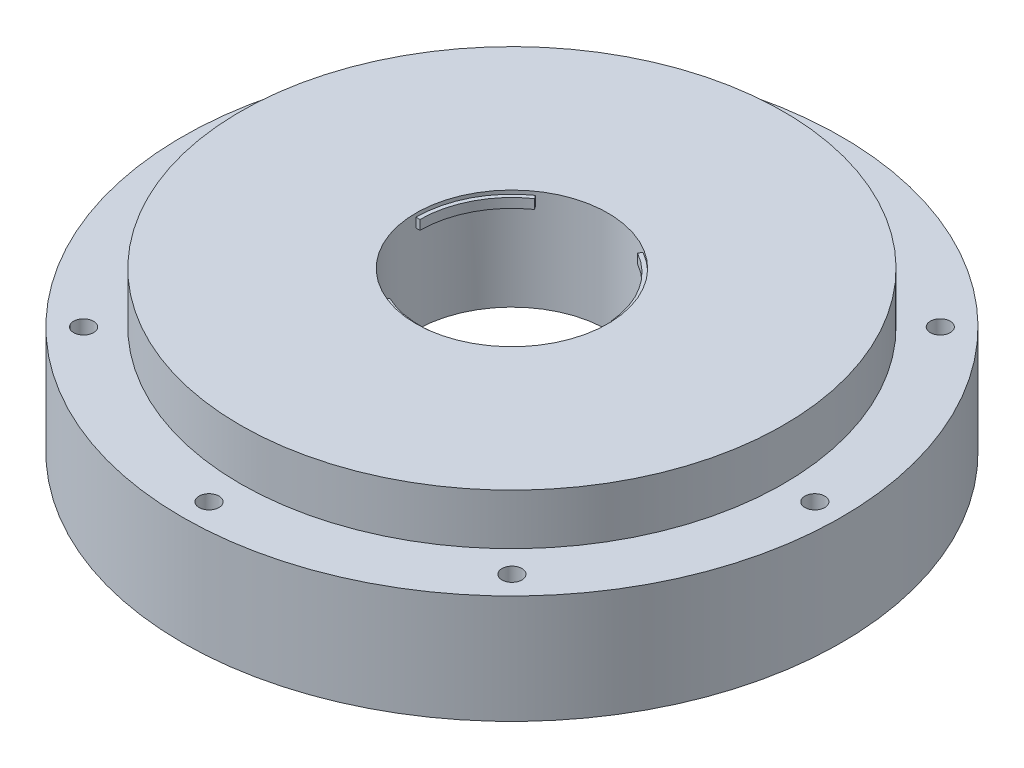
ISO-10303-21;
HEADER;
FILE_DESCRIPTION(('STEP AP214'),'2;1');
FILE_NAME('part.step','',(''),(''),'','','');
FILE_SCHEMA(('AUTOMOTIVE_DESIGN { 1 0 10303 214 1 1 1 1 }'));
ENDSEC;
DATA;
#1=APPLICATION_CONTEXT('core data for automotive mechanical design processes');
#2=APPLICATION_PROTOCOL_DEFINITION('international standard','automotive_design',2000,#1);
#3=PRODUCT_CONTEXT('',#1,'mechanical');
#4=PRODUCT('Part','Part','',(#3));
#5=PRODUCT_RELATED_PRODUCT_CATEGORY('part','',(#4));
#6=PRODUCT_DEFINITION_FORMATION('','',#4);
#7=PRODUCT_DEFINITION_CONTEXT('part definition',#1,'design');
#8=PRODUCT_DEFINITION('design','',#6,#7);
#9=PRODUCT_DEFINITION_SHAPE('','',#8);
#10=(LENGTH_UNIT() NAMED_UNIT(*) SI_UNIT(.MILLI.,.METRE.));
#11=(NAMED_UNIT(*) PLANE_ANGLE_UNIT() SI_UNIT($,.RADIAN.));
#12=(NAMED_UNIT(*) SI_UNIT($,.STERADIAN.) SOLID_ANGLE_UNIT());
#13=UNCERTAINTY_MEASURE_WITH_UNIT(LENGTH_MEASURE(1.E-05),#10,'distance_accuracy_value','');
#14=(GEOMETRIC_REPRESENTATION_CONTEXT(3) GLOBAL_UNCERTAINTY_ASSIGNED_CONTEXT((#13)) GLOBAL_UNIT_ASSIGNED_CONTEXT((#10,
#11,#12)) REPRESENTATION_CONTEXT('',''));
#15=CARTESIAN_POINT('',(0.,0.,0.));
#16=DIRECTION('',(0.,0.,1.));
#17=DIRECTION('',(1.,0.,0.));
#18=AXIS2_PLACEMENT_3D('',#15,#16,#17);
#19=CARTESIAN_POINT('',(0.,16.,0.));
#20=DIRECTION('',(0.,1.,0.));
#21=DIRECTION('',(0.,0.,1.));
#22=AXIS2_PLACEMENT_3D('',#19,#20,#21);
#23=CYLINDRICAL_SURFACE('',#22,26.5);
#24=DIRECTION('',(0.,-1.,0.));
#25=VECTOR('',#24,1.);
#26=CARTESIAN_POINT('',(-11.1993839361285,43.,24.0171563564713));
#27=LINE('',#26,#25);
#28=CARTESIAN_POINT('',(-11.1993839361285,43.,24.0171563564713));
#29=VERTEX_POINT('',#28);
#30=CARTESIAN_POINT('',(-11.1993839361285,40.4,24.0171563564713));
#31=VERTEX_POINT('',#30);
#32=EDGE_CURVE('E162',#29,#31,#27,.T.);
#33=ORIENTED_EDGE('',*,*,#32,.T.);
#34=CARTESIAN_POINT('',(0.,40.4,0.));
#35=DIRECTION('',(0.,1.,0.));
#36=DIRECTION('',(0.866025403784436,0.,-0.500000000000004));
#37=AXIS2_PLACEMENT_3D('',#34,#35,#36);
#38=CIRCLE('',#37,26.5);
#39=CARTESIAN_POINT('',(13.2500000000001,40.4,22.9496732002876));
#40=VERTEX_POINT('',#39);
#41=EDGE_CURVE('E175',#31,#40,#38,.T.);
#42=ORIENTED_EDGE('',*,*,#41,.T.);
#43=DIRECTION('',(0.,-1.,0.));
#44=VECTOR('',#43,1.);
#45=CARTESIAN_POINT('',(13.2500000000001,43.,22.9496732002876));
#46=LINE('',#45,#44);
#47=CARTESIAN_POINT('',(13.2500000000001,43.,22.9496732002876));
#48=VERTEX_POINT('',#47);
#49=EDGE_CURVE('E153',#48,#40,#46,.T.);
#50=ORIENTED_EDGE('',*,*,#49,.F.);
#51=CARTESIAN_POINT('',(0.,43.,0.));
#52=DIRECTION('',(0.,1.,0.));
#53=DIRECTION('',(0.866025403784436,0.,-0.500000000000004));
#54=AXIS2_PLACEMENT_3D('',#51,#52,#53);
#55=CIRCLE('',#54,26.5);
#56=EDGE_CURVE('E178',#29,#48,#55,.T.);
#57=ORIENTED_EDGE('',*,*,#56,.F.);
#58=EDGE_LOOP('',(#33,#42,#50,#57));
#59=FACE_BOUND('',#58,.T.);
#60=CARTESIAN_POINT('',(0.,44.,0.));
#61=DIRECTION('',(0.,1.,0.));
#62=DIRECTION('',(0.,0.,1.));
#63=AXIS2_PLACEMENT_3D('',#60,#61,#62);
#64=CIRCLE('',#63,26.5);
#65=CARTESIAN_POINT('',(0.,44.,26.5));
#66=VERTEX_POINT('',#65);
#67=EDGE_CURVE('E211',#66,#66,#64,.T.);
#68=ORIENTED_EDGE('',*,*,#67,.T.);
#69=EDGE_LOOP('',(#68));
#70=FACE_BOUND('',#69,.T.);
#71=CARTESIAN_POINT('',(0.,16.,0.));
#72=DIRECTION('',(0.,1.,0.));
#73=DIRECTION('',(0.,0.,1.));
#74=AXIS2_PLACEMENT_3D('',#71,#72,#73);
#75=CIRCLE('',#74,26.5);
#76=CARTESIAN_POINT('',(0.,16.,26.5));
#77=VERTEX_POINT('',#76);
#78=EDGE_CURVE('E217',#77,#77,#75,.T.);
#79=ORIENTED_EDGE('',*,*,#78,.F.);
#80=EDGE_LOOP('',(#79));
#81=FACE_BOUND('',#80,.T.);
#82=DIRECTION('',(0.,-1.,0.));
#83=VECTOR('',#82,1.);
#84=CARTESIAN_POINT('',(-15.1997755633027,43.,-21.7075291736583));
#85=LINE('',#84,#83);
#86=CARTESIAN_POINT('',(-15.1997755633027,43.,-21.7075291736583));
#87=VERTEX_POINT('',#86);
#88=CARTESIAN_POINT('',(-15.1997755633027,40.4,-21.7075291736583));
#89=VERTEX_POINT('',#88);
#90=EDGE_CURVE('E192',#87,#89,#85,.T.);
#91=ORIENTED_EDGE('',*,*,#90,.T.);
#92=CARTESIAN_POINT('',(0.,40.4,0.));
#93=DIRECTION('',(0.,1.,0.));
#94=DIRECTION('',(0.,0.,1.));
#95=AXIS2_PLACEMENT_3D('',#92,#93,#94);
#96=CIRCLE('',#95,26.5);
#97=CARTESIAN_POINT('',(-26.5,40.4,0.));
#98=VERTEX_POINT('',#97);
#99=EDGE_CURVE('E205',#89,#98,#96,.T.);
#100=ORIENTED_EDGE('',*,*,#99,.T.);
#101=DIRECTION('',(0.,-1.,0.));
#102=VECTOR('',#101,1.);
#103=CARTESIAN_POINT('',(-26.5,43.,0.));
#104=LINE('',#103,#102);
#105=CARTESIAN_POINT('',(-26.5,43.,0.));
#106=VERTEX_POINT('',#105);
#107=EDGE_CURVE('E182',#106,#98,#104,.T.);
#108=ORIENTED_EDGE('',*,*,#107,.F.);
#109=CARTESIAN_POINT('',(0.,43.,0.));
#110=DIRECTION('',(0.,1.,0.));
#111=DIRECTION('',(0.,0.,1.));
#112=AXIS2_PLACEMENT_3D('',#109,#110,#111);
#113=CIRCLE('',#112,26.5);
#114=EDGE_CURVE('E208',#87,#106,#113,.T.);
#115=ORIENTED_EDGE('',*,*,#114,.F.);
#116=EDGE_LOOP('',(#91,#100,#108,#115));
#117=FACE_BOUND('',#116,.T.);
#118=DIRECTION('',(0.,-1.,0.));
#119=VECTOR('',#118,1.);
#120=CARTESIAN_POINT('',(26.3991594994312,43.,-2.30962718281313));
#121=LINE('',#120,#119);
#122=CARTESIAN_POINT('',(26.3991594994312,43.,-2.30962718281313));
#123=VERTEX_POINT('',#122);
#124=CARTESIAN_POINT('',(26.3991594994312,40.4,-2.30962718281313));
#125=VERTEX_POINT('',#124);
#126=EDGE_CURVE('E144',#123,#125,#121,.T.);
#127=ORIENTED_EDGE('',*,*,#126,.T.);
#128=CARTESIAN_POINT('',(0.,40.4,0.));
#129=DIRECTION('',(0.,1.,0.));
#130=DIRECTION('',(-0.866025403784443,0.,-0.499999999999992));
#131=AXIS2_PLACEMENT_3D('',#128,#129,#130);
#132=CIRCLE('',#131,26.5);
#133=CARTESIAN_POINT('',(13.2499999999998,40.4,-22.9496732002877));
#134=VERTEX_POINT('',#133);
#135=EDGE_CURVE('E137',#125,#134,#132,.T.);
#136=ORIENTED_EDGE('',*,*,#135,.T.);
#137=DIRECTION('',(0.,-1.,0.));
#138=VECTOR('',#137,1.);
#139=CARTESIAN_POINT('',(13.2499999999998,43.,-22.9496732002877));
#140=LINE('',#139,#138);
#141=CARTESIAN_POINT('',(13.2499999999998,43.,-22.9496732002877));
#142=VERTEX_POINT('',#141);
#143=EDGE_CURVE('E125',#142,#134,#140,.T.);
#144=ORIENTED_EDGE('',*,*,#143,.F.);
#145=CARTESIAN_POINT('',(0.,43.,0.));
#146=DIRECTION('',(0.,1.,0.));
#147=DIRECTION('',(-0.866025403784443,0.,-0.499999999999992));
#148=AXIS2_PLACEMENT_3D('',#145,#146,#147);
#149=CIRCLE('',#148,26.5);
#150=EDGE_CURVE('E145',#123,#142,#149,.T.);
#151=ORIENTED_EDGE('',*,*,#150,.F.);
#152=EDGE_LOOP('',(#127,#136,#144,#151));
#153=FACE_BOUND('',#152,.T.);
#154=ADVANCED_FACE('F35',(#59,#70,#81,#117,#153),#23,.F.);
#155=CARTESIAN_POINT('',(0.,30.,0.));
#156=DIRECTION('',(0.,-1.,0.));
#157=DIRECTION('',(0.,0.,-1.));
#158=AXIS2_PLACEMENT_3D('',#155,#156,#157);
#159=CYLINDRICAL_SURFACE('',#158,65.);
#160=CARTESIAN_POINT('',(0.,0.,0.));
#161=DIRECTION('',(0.,1.,0.));
#162=DIRECTION('',(0.,0.,1.));
#163=AXIS2_PLACEMENT_3D('',#160,#161,#162);
#164=CIRCLE('',#163,65.);
#165=CARTESIAN_POINT('',(0.,0.,65.));
#166=VERTEX_POINT('',#165);
#167=EDGE_CURVE('E267',#166,#166,#164,.T.);
#168=ORIENTED_EDGE('',*,*,#167,.F.);
#169=EDGE_LOOP('',(#168));
#170=FACE_BOUND('',#169,.T.);
#171=CARTESIAN_POINT('',(0.,16.,0.));
#172=DIRECTION('',(0.,1.,0.));
#173=DIRECTION('',(0.,0.,1.));
#174=AXIS2_PLACEMENT_3D('',#171,#172,#173);
#175=CIRCLE('',#174,65.);
#176=CARTESIAN_POINT('',(0.,16.,65.));
#177=VERTEX_POINT('',#176);
#178=EDGE_CURVE('E220',#177,#177,#175,.T.);
#179=ORIENTED_EDGE('',*,*,#178,.T.);
#180=EDGE_LOOP('',(#179));
#181=FACE_BOUND('',#180,.T.);
#182=ADVANCED_FACE('F279',(#170,#181),#159,.F.);
#183=CARTESIAN_POINT('',(0.,30.,0.));
#184=DIRECTION('',(0.,1.,0.));
#185=DIRECTION('',(0.,0.,1.));
#186=AXIS2_PLACEMENT_3D('',#183,#184,#185);
#187=PLANE('',#186);
#188=CARTESIAN_POINT('',(0.,30.,0.));
#189=DIRECTION('',(0.,1.,0.));
#190=DIRECTION('',(0.,0.,1.));
#191=AXIS2_PLACEMENT_3D('',#188,#189,#190);
#192=CIRCLE('',#191,75.);
#193=CARTESIAN_POINT('',(0.,30.,75.));
#194=VERTEX_POINT('',#193);
#195=EDGE_CURVE('E11',#194,#194,#192,.T.);
#196=ORIENTED_EDGE('',*,*,#195,.F.);
#197=EDGE_LOOP('',(#196));
#198=FACE_BOUND('',#197,.T.);
#199=CARTESIAN_POINT('',(-83.6349999999965,30.,3.53434947975018E-12));
#200=DIRECTION('',(0.,1.,0.));
#201=DIRECTION('',(0.,0.,1.));
#202=AXIS2_PLACEMENT_3D('',#199,#200,#201);
#203=CIRCLE('',#202,2.75000000000522);
#204=CARTESIAN_POINT('',(-83.6349999999965,30.,2.75000000000875));
#205=VERTEX_POINT('',#204);
#206=EDGE_CURVE('E228',#205,#205,#203,.T.);
#207=ORIENTED_EDGE('',*,*,#206,.F.);
#208=EDGE_LOOP('',(#207));
#209=FACE_BOUND('',#208,.T.);
#210=CARTESIAN_POINT('',(7.04821429249101E-12,30.,83.635));
#211=DIRECTION('',(0.,1.,0.));
#212=DIRECTION('',(0.,0.,1.));
#213=AXIS2_PLACEMENT_3D('',#210,#211,#212);
#214=CIRCLE('',#213,2.75000000000727);
#215=CARTESIAN_POINT('',(7.04821429249101E-12,30.,86.3850000000073));
#216=VERTEX_POINT('',#215);
#217=EDGE_CURVE('E240',#216,#216,#214,.T.);
#218=ORIENTED_EDGE('',*,*,#217,.F.);
#219=EDGE_LOOP('',(#218));
#220=FACE_BOUND('',#219,.T.);
#221=CARTESIAN_POINT('',(83.6350000000035,30.,-3.52410714624551E-12));
#222=DIRECTION('',(0.,1.,0.));
#223=DIRECTION('',(0.,0.,1.));
#224=AXIS2_PLACEMENT_3D('',#221,#222,#223);
#225=CIRCLE('',#224,2.75000000000259);
#226=CARTESIAN_POINT('',(83.6350000000035,30.,2.74999999999906));
#227=VERTEX_POINT('',#226);
#228=EDGE_CURVE('E252',#227,#227,#225,.T.);
#229=ORIENTED_EDGE('',*,*,#228,.F.);
#230=EDGE_LOOP('',(#229));
#231=FACE_BOUND('',#230,.T.);
#232=CARTESIAN_POINT('',(0.,30.,-83.635));
#233=DIRECTION('',(0.,1.,0.));
#234=DIRECTION('',(0.,0.,1.));
#235=AXIS2_PLACEMENT_3D('',#232,#233,#234);
#236=CIRCLE('',#235,2.75);
#237=CARTESIAN_POINT('',(0.,30.,-80.885));
#238=VERTEX_POINT('',#237);
#239=EDGE_CURVE('E264',#238,#238,#236,.T.);
#240=ORIENTED_EDGE('',*,*,#239,.F.);
#241=EDGE_LOOP('',(#240));
#242=FACE_BOUND('',#241,.T.);
#243=CARTESIAN_POINT('',(0.,30.,0.));
#244=DIRECTION('',(0.,1.,0.));
#245=DIRECTION('',(0.,0.,1.));
#246=AXIS2_PLACEMENT_3D('',#243,#244,#245);
#247=CIRCLE('',#246,91.);
#248=CARTESIAN_POINT('',(0.,30.,91.));
#249=VERTEX_POINT('',#248);
#250=EDGE_CURVE('E43',#249,#249,#247,.T.);
#251=ORIENTED_EDGE('',*,*,#250,.T.);
#252=EDGE_LOOP('',(#251));
#253=FACE_BOUND('',#252,.T.);
#254=CARTESIAN_POINT('',(59.1388756445379,30.,-59.1388756445394));
#255=DIRECTION('',(0.,1.,0.));
#256=DIRECTION('',(0.,0.,1.));
#257=AXIS2_PLACEMENT_3D('',#254,#255,#256);
#258=CIRCLE('',#257,2.75000000000035);
#259=CARTESIAN_POINT('',(59.1388756445379,30.,-56.388875644539));
#260=VERTEX_POINT('',#259);
#261=EDGE_CURVE('E258',#260,#260,#258,.T.);
#262=ORIENTED_EDGE('',*,*,#261,.F.);
#263=EDGE_LOOP('',(#262));
#264=FACE_BOUND('',#263,.T.);
#265=CARTESIAN_POINT('',(59.1388756445429,30.,59.1388756445344));
#266=DIRECTION('',(0.,1.,0.));
#267=DIRECTION('',(0.,0.,1.));
#268=AXIS2_PLACEMENT_3D('',#265,#266,#267);
#269=CIRCLE('',#268,2.7500000000054);
#270=CARTESIAN_POINT('',(59.1388756445429,30.,61.8888756445398));
#271=VERTEX_POINT('',#270);
#272=EDGE_CURVE('E246',#271,#271,#269,.T.);
#273=ORIENTED_EDGE('',*,*,#272,.F.);
#274=EDGE_LOOP('',(#273));
#275=FACE_BOUND('',#274,.T.);
#276=CARTESIAN_POINT('',(-59.1388756445309,30.,59.1388756445394));
#277=DIRECTION('',(0.,1.,0.));
#278=DIRECTION('',(0.,0.,1.));
#279=AXIS2_PLACEMENT_3D('',#276,#277,#278);
#280=CIRCLE('',#279,2.75000000000716);
#281=CARTESIAN_POINT('',(-59.1388756445309,30.,61.8888756445466));
#282=VERTEX_POINT('',#281);
#283=EDGE_CURVE('E234',#282,#282,#280,.T.);
#284=ORIENTED_EDGE('',*,*,#283,.F.);
#285=EDGE_LOOP('',(#284));
#286=FACE_BOUND('',#285,.T.);
#287=CARTESIAN_POINT('',(-59.1388756445359,30.,-59.1388756445344));
#288=DIRECTION('',(0.,1.,0.));
#289=DIRECTION('',(0.,0.,1.));
#290=AXIS2_PLACEMENT_3D('',#287,#288,#289);
#291=CIRCLE('',#290,2.75000000000267);
#292=CARTESIAN_POINT('',(-59.1388756445359,30.,-56.3888756445317));
#293=VERTEX_POINT('',#292);
#294=EDGE_CURVE('E221',#293,#293,#291,.T.);
#295=ORIENTED_EDGE('',*,*,#294,.F.);
#296=EDGE_LOOP('',(#295));
#297=FACE_BOUND('',#296,.T.);
#298=ADVANCED_FACE('F303',(#198,#209,#220,#231,#242,#253,#264,#275,#286,#297),#187,.T.);
#299=CARTESIAN_POINT('',(0.,0.,0.));
#300=DIRECTION('',(0.,1.,0.));
#301=DIRECTION('',(0.,0.,1.));
#302=AXIS2_PLACEMENT_3D('',#299,#300,#301);
#303=PLANE('',#302);
#304=CARTESIAN_POINT('',(0.,0.,0.));
#305=DIRECTION('',(0.,1.,0.));
#306=DIRECTION('',(0.,0.,1.));
#307=AXIS2_PLACEMENT_3D('',#304,#305,#306);
#308=CIRCLE('',#307,91.);
#309=CARTESIAN_POINT('',(0.,0.,91.));
#310=VERTEX_POINT('',#309);
#311=EDGE_CURVE('E272',#310,#310,#308,.T.);
#312=ORIENTED_EDGE('',*,*,#311,.F.);
#313=EDGE_LOOP('',(#312));
#314=FACE_BOUND('',#313,.T.);
#315=ORIENTED_EDGE('',*,*,#167,.T.);
#316=EDGE_LOOP('',(#315));
#317=FACE_BOUND('',#316,.T.);
#318=CARTESIAN_POINT('',(0.,0.,-83.635));
#319=DIRECTION('',(0.,1.,0.));
#320=DIRECTION('',(0.,0.,1.));
#321=AXIS2_PLACEMENT_3D('',#318,#319,#320);
#322=CIRCLE('',#321,2.75);
#323=CARTESIAN_POINT('',(0.,0.,-80.885));
#324=VERTEX_POINT('',#323);
#325=EDGE_CURVE('E261',#324,#324,#322,.T.);
#326=ORIENTED_EDGE('',*,*,#325,.T.);
#327=EDGE_LOOP('',(#326));
#328=FACE_BOUND('',#327,.T.);
#329=CARTESIAN_POINT('',(59.1388756445379,0.,-59.1388756445394));
#330=DIRECTION('',(0.,1.,0.));
#331=DIRECTION('',(0.,0.,1.));
#332=AXIS2_PLACEMENT_3D('',#329,#330,#331);
#333=CIRCLE('',#332,2.75000000000035);
#334=CARTESIAN_POINT('',(59.1388756445379,0.,-56.388875644539));
#335=VERTEX_POINT('',#334);
#336=EDGE_CURVE('E255',#335,#335,#333,.T.);
#337=ORIENTED_EDGE('',*,*,#336,.T.);
#338=EDGE_LOOP('',(#337));
#339=FACE_BOUND('',#338,.T.);
#340=CARTESIAN_POINT('',(83.6350000000035,0.,-3.52410714624551E-12));
#341=DIRECTION('',(0.,1.,0.));
#342=DIRECTION('',(0.,0.,1.));
#343=AXIS2_PLACEMENT_3D('',#340,#341,#342);
#344=CIRCLE('',#343,2.75000000000259);
#345=CARTESIAN_POINT('',(83.6350000000035,0.,2.74999999999906));
#346=VERTEX_POINT('',#345);
#347=EDGE_CURVE('E249',#346,#346,#344,.T.);
#348=ORIENTED_EDGE('',*,*,#347,.T.);
#349=EDGE_LOOP('',(#348));
#350=FACE_BOUND('',#349,.T.);
#351=CARTESIAN_POINT('',(59.1388756445429,0.,59.1388756445344));
#352=DIRECTION('',(0.,1.,0.));
#353=DIRECTION('',(0.,0.,1.));
#354=AXIS2_PLACEMENT_3D('',#351,#352,#353);
#355=CIRCLE('',#354,2.7500000000054);
#356=CARTESIAN_POINT('',(59.1388756445429,0.,61.8888756445398));
#357=VERTEX_POINT('',#356);
#358=EDGE_CURVE('E243',#357,#357,#355,.T.);
#359=ORIENTED_EDGE('',*,*,#358,.T.);
#360=EDGE_LOOP('',(#359));
#361=FACE_BOUND('',#360,.T.);
#362=CARTESIAN_POINT('',(7.04821429249101E-12,0.,83.635));
#363=DIRECTION('',(0.,1.,0.));
#364=DIRECTION('',(0.,0.,1.));
#365=AXIS2_PLACEMENT_3D('',#362,#363,#364);
#366=CIRCLE('',#365,2.75000000000727);
#367=CARTESIAN_POINT('',(7.04821429249101E-12,0.,86.3850000000073));
#368=VERTEX_POINT('',#367);
#369=EDGE_CURVE('E237',#368,#368,#366,.T.);
#370=ORIENTED_EDGE('',*,*,#369,.T.);
#371=EDGE_LOOP('',(#370));
#372=FACE_BOUND('',#371,.T.);
#373=CARTESIAN_POINT('',(-59.1388756445309,0.,59.1388756445394));
#374=DIRECTION('',(0.,1.,0.));
#375=DIRECTION('',(0.,0.,1.));
#376=AXIS2_PLACEMENT_3D('',#373,#374,#375);
#377=CIRCLE('',#376,2.75000000000716);
#378=CARTESIAN_POINT('',(-59.1388756445309,0.,61.8888756445466));
#379=VERTEX_POINT('',#378);
#380=EDGE_CURVE('E231',#379,#379,#377,.T.);
#381=ORIENTED_EDGE('',*,*,#380,.T.);
#382=EDGE_LOOP('',(#381));
#383=FACE_BOUND('',#382,.T.);
#384=CARTESIAN_POINT('',(-83.6349999999965,0.,3.53434947975018E-12));
#385=DIRECTION('',(0.,1.,0.));
#386=DIRECTION('',(0.,0.,1.));
#387=AXIS2_PLACEMENT_3D('',#384,#385,#386);
#388=CIRCLE('',#387,2.75000000000522);
#389=CARTESIAN_POINT('',(-83.6349999999965,0.,2.75000000000875));
#390=VERTEX_POINT('',#389);
#391=EDGE_CURVE('E224',#390,#390,#388,.T.);
#392=ORIENTED_EDGE('',*,*,#391,.T.);
#393=EDGE_LOOP('',(#392));
#394=FACE_BOUND('',#393,.T.);
#395=CARTESIAN_POINT('',(-59.1388756445359,0.,-59.1388756445344));
#396=DIRECTION('',(0.,1.,0.));
#397=DIRECTION('',(0.,0.,1.));
#398=AXIS2_PLACEMENT_3D('',#395,#396,#397);
#399=CIRCLE('',#398,2.75000000000267);
#400=CARTESIAN_POINT('',(-59.1388756445359,0.,-56.3888756445317));
#401=VERTEX_POINT('',#400);
#402=EDGE_CURVE('E225',#401,#401,#399,.T.);
#403=ORIENTED_EDGE('',*,*,#402,.T.);
#404=EDGE_LOOP('',(#403));
#405=FACE_BOUND('',#404,.T.);
#406=ADVANCED_FACE('F445',(#314,#317,#328,#339,#350,#361,#372,#383,#394,#405),#303,.F.);
#407=CARTESIAN_POINT('',(0.,30.,0.));
#408=DIRECTION('',(0.,-1.,0.));
#409=DIRECTION('',(0.,0.,-1.));
#410=AXIS2_PLACEMENT_3D('',#407,#408,#409);
#411=CYLINDRICAL_SURFACE('',#410,91.);
#412=ORIENTED_EDGE('',*,*,#250,.F.);
#413=EDGE_LOOP('',(#412));
#414=FACE_BOUND('',#413,.T.);
#415=ORIENTED_EDGE('',*,*,#311,.T.);
#416=EDGE_LOOP('',(#415));
#417=FACE_BOUND('',#416,.T.);
#418=ADVANCED_FACE('F37',(#414,#417),#411,.T.);
#419=CARTESIAN_POINT('',(0.,30.,-83.635));
#420=DIRECTION('',(0.,-1.,0.));
#421=DIRECTION('',(0.,0.,-1.));
#422=AXIS2_PLACEMENT_3D('',#419,#420,#421);
#423=CYLINDRICAL_SURFACE('',#422,2.75);
#424=ORIENTED_EDGE('',*,*,#239,.T.);
#425=EDGE_LOOP('',(#424));
#426=FACE_BOUND('',#425,.T.);
#427=ORIENTED_EDGE('',*,*,#325,.F.);
#428=EDGE_LOOP('',(#427));
#429=FACE_BOUND('',#428,.T.);
#430=ADVANCED_FACE('F518',(#426,#429),#423,.F.);
#431=CARTESIAN_POINT('',(59.1388756445379,30.,-59.1388756445394));
#432=DIRECTION('',(0.,-1.,0.));
#433=DIRECTION('',(0.,0.,-1.));
#434=AXIS2_PLACEMENT_3D('',#431,#432,#433);
#435=CYLINDRICAL_SURFACE('',#434,2.75000000000035);
#436=ORIENTED_EDGE('',*,*,#261,.T.);
#437=EDGE_LOOP('',(#436));
#438=FACE_BOUND('',#437,.T.);
#439=ORIENTED_EDGE('',*,*,#336,.F.);
#440=EDGE_LOOP('',(#439));
#441=FACE_BOUND('',#440,.T.);
#442=ADVANCED_FACE('F508',(#438,#441),#435,.F.);
#443=CARTESIAN_POINT('',(83.6350000000035,30.,-3.52410714624551E-12));
#444=DIRECTION('',(0.,-1.,0.));
#445=DIRECTION('',(0.,0.,-1.));
#446=AXIS2_PLACEMENT_3D('',#443,#444,#445);
#447=CYLINDRICAL_SURFACE('',#446,2.75000000000259);
#448=ORIENTED_EDGE('',*,*,#228,.T.);
#449=EDGE_LOOP('',(#448));
#450=FACE_BOUND('',#449,.T.);
#451=ORIENTED_EDGE('',*,*,#347,.F.);
#452=EDGE_LOOP('',(#451));
#453=FACE_BOUND('',#452,.T.);
#454=ADVANCED_FACE('F498',(#450,#453),#447,.F.);
#455=CARTESIAN_POINT('',(59.1388756445429,30.,59.1388756445344));
#456=DIRECTION('',(0.,-1.,0.));
#457=DIRECTION('',(0.,0.,-1.));
#458=AXIS2_PLACEMENT_3D('',#455,#456,#457);
#459=CYLINDRICAL_SURFACE('',#458,2.7500000000054);
#460=ORIENTED_EDGE('',*,*,#272,.T.);
#461=EDGE_LOOP('',(#460));
#462=FACE_BOUND('',#461,.T.);
#463=ORIENTED_EDGE('',*,*,#358,.F.);
#464=EDGE_LOOP('',(#463));
#465=FACE_BOUND('',#464,.T.);
#466=ADVANCED_FACE('F488',(#462,#465),#459,.F.);
#467=CARTESIAN_POINT('',(7.04821429249101E-12,30.,83.635));
#468=DIRECTION('',(0.,-1.,0.));
#469=DIRECTION('',(0.,0.,-1.));
#470=AXIS2_PLACEMENT_3D('',#467,#468,#469);
#471=CYLINDRICAL_SURFACE('',#470,2.75000000000727);
#472=ORIENTED_EDGE('',*,*,#217,.T.);
#473=EDGE_LOOP('',(#472));
#474=FACE_BOUND('',#473,.T.);
#475=ORIENTED_EDGE('',*,*,#369,.F.);
#476=EDGE_LOOP('',(#475));
#477=FACE_BOUND('',#476,.T.);
#478=ADVANCED_FACE('F478',(#474,#477),#471,.F.);
#479=CARTESIAN_POINT('',(-59.1388756445309,30.,59.1388756445394));
#480=DIRECTION('',(0.,-1.,0.));
#481=DIRECTION('',(0.,0.,-1.));
#482=AXIS2_PLACEMENT_3D('',#479,#480,#481);
#483=CYLINDRICAL_SURFACE('',#482,2.75000000000716);
#484=ORIENTED_EDGE('',*,*,#283,.T.);
#485=EDGE_LOOP('',(#484));
#486=FACE_BOUND('',#485,.T.);
#487=ORIENTED_EDGE('',*,*,#380,.F.);
#488=EDGE_LOOP('',(#487));
#489=FACE_BOUND('',#488,.T.);
#490=ADVANCED_FACE('F468',(#486,#489),#483,.F.);
#491=CARTESIAN_POINT('',(-83.6349999999965,30.,3.53434947975018E-12));
#492=DIRECTION('',(0.,-1.,0.));
#493=DIRECTION('',(0.,0.,-1.));
#494=AXIS2_PLACEMENT_3D('',#491,#492,#493);
#495=CYLINDRICAL_SURFACE('',#494,2.75000000000522);
#496=ORIENTED_EDGE('',*,*,#206,.T.);
#497=EDGE_LOOP('',(#496));
#498=FACE_BOUND('',#497,.T.);
#499=ORIENTED_EDGE('',*,*,#391,.F.);
#500=EDGE_LOOP('',(#499));
#501=FACE_BOUND('',#500,.T.);
#502=ADVANCED_FACE('F294',(#498,#501),#495,.F.);
#503=CARTESIAN_POINT('',(-59.1388756445359,30.,-59.1388756445344));
#504=DIRECTION('',(0.,-1.,0.));
#505=DIRECTION('',(0.,0.,-1.));
#506=AXIS2_PLACEMENT_3D('',#503,#504,#505);
#507=CYLINDRICAL_SURFACE('',#506,2.75000000000267);
#508=ORIENTED_EDGE('',*,*,#294,.T.);
#509=EDGE_LOOP('',(#508));
#510=FACE_BOUND('',#509,.T.);
#511=ORIENTED_EDGE('',*,*,#402,.F.);
#512=EDGE_LOOP('',(#511));
#513=FACE_BOUND('',#512,.T.);
#514=ADVANCED_FACE('F284',(#510,#513),#507,.F.);
#515=CARTESIAN_POINT('',(0.,16.,0.));
#516=DIRECTION('',(0.,1.,0.));
#517=DIRECTION('',(0.,0.,1.));
#518=AXIS2_PLACEMENT_3D('',#515,#516,#517);
#519=PLANE('',#518);
#520=ORIENTED_EDGE('',*,*,#78,.T.);
#521=EDGE_LOOP('',(#520));
#522=FACE_BOUND('',#521,.T.);
#523=ORIENTED_EDGE('',*,*,#178,.F.);
#524=EDGE_LOOP('',(#523));
#525=FACE_BOUND('',#524,.T.);
#526=ADVANCED_FACE('F281',(#522,#525),#519,.F.);
#527=CARTESIAN_POINT('',(0.,16.,0.));
#528=DIRECTION('',(0.,1.,0.));
#529=DIRECTION('',(0.,0.,1.));
#530=AXIS2_PLACEMENT_3D('',#527,#528,#529);
#531=CYLINDRICAL_SURFACE('',#530,75.);
#532=ORIENTED_EDGE('',*,*,#195,.T.);
#533=EDGE_LOOP('',(#532));
#534=FACE_BOUND('',#533,.T.);
#535=CARTESIAN_POINT('',(0.,44.,0.));
#536=DIRECTION('',(0.,1.,0.));
#537=DIRECTION('',(0.,0.,1.));
#538=AXIS2_PLACEMENT_3D('',#535,#536,#537);
#539=CIRCLE('',#538,75.);
#540=CARTESIAN_POINT('',(0.,44.,75.));
#541=VERTEX_POINT('',#540);
#542=EDGE_CURVE('E214',#541,#541,#539,.T.);
#543=ORIENTED_EDGE('',*,*,#542,.F.);
#544=EDGE_LOOP('',(#543));
#545=FACE_BOUND('',#544,.T.);
#546=ADVANCED_FACE('F283',(#534,#545),#531,.T.);
#547=CARTESIAN_POINT('',(0.,44.,0.));
#548=DIRECTION('',(0.,1.,0.));
#549=DIRECTION('',(0.,0.,1.));
#550=AXIS2_PLACEMENT_3D('',#547,#548,#549);
#551=PLANE('',#550);
#552=ORIENTED_EDGE('',*,*,#542,.T.);
#553=EDGE_LOOP('',(#552));
#554=FACE_BOUND('',#553,.T.);
#555=ORIENTED_EDGE('',*,*,#67,.F.);
#556=EDGE_LOOP('',(#555));
#557=FACE_BOUND('',#556,.T.);
#558=ADVANCED_FACE('F291',(#554,#557),#551,.T.);
#559=CARTESIAN_POINT('',(-14.5688414833165,43.,-20.8064619249404));
#560=DIRECTION('',(0.,1.,0.));
#561=DIRECTION('',(0.,0.,1.));
#562=AXIS2_PLACEMENT_3D('',#559,#560,#561);
#563=PLANE('',#562);
#564=ORIENTED_EDGE('',*,*,#114,.T.);
#565=DIRECTION('',(-1.,0.,0.));
#566=VECTOR('',#565,1.);
#567=CARTESIAN_POINT('',(-25.4,43.,0.));
#568=LINE('',#567,#566);
#569=CARTESIAN_POINT('',(-25.4,43.,0.));
#570=VERTEX_POINT('',#569);
#571=EDGE_CURVE('E180',#570,#106,#568,.T.);
#572=ORIENTED_EDGE('',*,*,#571,.F.);
#573=CARTESIAN_POINT('',(0.,43.,0.));
#574=DIRECTION('',(0.,1.,0.));
#575=DIRECTION('',(0.,0.,1.));
#576=AXIS2_PLACEMENT_3D('',#573,#574,#575);
#577=CIRCLE('',#576,25.4);
#578=CARTESIAN_POINT('',(-14.5688414833165,43.,-20.8064619249404));
#579=VERTEX_POINT('',#578);
#580=EDGE_CURVE('E201',#579,#570,#577,.T.);
#581=ORIENTED_EDGE('',*,*,#580,.F.);
#582=DIRECTION('',(-0.573576436351044,0.,-0.819152044288993));
#583=VECTOR('',#582,1.);
#584=CARTESIAN_POINT('',(-14.5688414833165,43.,-20.8064619249404));
#585=LINE('',#584,#583);
#586=EDGE_CURVE('E190',#579,#87,#585,.T.);
#587=ORIENTED_EDGE('',*,*,#586,.T.);
#588=EDGE_LOOP('',(#564,#572,#581,#587));
#589=FACE_BOUND('',#588,.T.);
#590=ADVANCED_FACE('F310',(#589),#563,.T.);
#591=CARTESIAN_POINT('',(-15.1997755633027,40.4,-21.7075291736583));
#592=DIRECTION('',(0.,-1.,0.));
#593=DIRECTION('',(0.,0.,-1.));
#594=AXIS2_PLACEMENT_3D('',#591,#592,#593);
#595=PLANE('',#594);
#596=CARTESIAN_POINT('',(0.,40.4,0.));
#597=DIRECTION('',(0.,1.,0.));
#598=DIRECTION('',(0.,0.,1.));
#599=AXIS2_PLACEMENT_3D('',#596,#597,#598);
#600=CIRCLE('',#599,25.4);
#601=CARTESIAN_POINT('',(-14.5688414833165,40.4,-20.8064619249404));
#602=VERTEX_POINT('',#601);
#603=CARTESIAN_POINT('',(-25.4,40.4,0.));
#604=VERTEX_POINT('',#603);
#605=EDGE_CURVE('E203',#602,#604,#600,.T.);
#606=ORIENTED_EDGE('',*,*,#605,.T.);
#607=DIRECTION('',(1.,0.,0.));
#608=VECTOR('',#607,1.);
#609=CARTESIAN_POINT('',(-26.5,40.4,0.));
#610=LINE('',#609,#608);
#611=EDGE_CURVE('E184',#98,#604,#610,.T.);
#612=ORIENTED_EDGE('',*,*,#611,.F.);
#613=ORIENTED_EDGE('',*,*,#99,.F.);
#614=DIRECTION('',(0.573576436351044,0.,0.819152044288993));
#615=VECTOR('',#614,1.);
#616=CARTESIAN_POINT('',(-15.1997755633027,40.4,-21.7075291736583));
#617=LINE('',#616,#615);
#618=EDGE_CURVE('E195',#89,#602,#617,.T.);
#619=ORIENTED_EDGE('',*,*,#618,.T.);
#620=EDGE_LOOP('',(#606,#612,#613,#619));
#621=FACE_BOUND('',#620,.T.);
#622=ADVANCED_FACE('F312',(#621),#595,.T.);
#623=CARTESIAN_POINT('',(0.,48.211759647117,0.));
#624=DIRECTION('',(0.,1.,0.));
#625=DIRECTION('',(0.,0.,1.));
#626=AXIS2_PLACEMENT_3D('',#623,#624,#625);
#627=CYLINDRICAL_SURFACE('',#626,25.4);
#628=DIRECTION('',(0.,1.,0.));
#629=VECTOR('',#628,1.);
#630=CARTESIAN_POINT('',(-14.5688414833165,40.4,-20.8064619249404));
#631=LINE('',#630,#629);
#632=EDGE_CURVE('E198',#602,#579,#631,.T.);
#633=ORIENTED_EDGE('',*,*,#632,.T.);
#634=ORIENTED_EDGE('',*,*,#580,.T.);
#635=DIRECTION('',(0.,1.,0.));
#636=VECTOR('',#635,1.);
#637=CARTESIAN_POINT('',(-25.4,40.4,0.));
#638=LINE('',#637,#636);
#639=EDGE_CURVE('E187',#604,#570,#638,.T.);
#640=ORIENTED_EDGE('',*,*,#639,.F.);
#641=ORIENTED_EDGE('',*,*,#605,.F.);
#642=EDGE_LOOP('',(#633,#634,#640,#641));
#643=FACE_BOUND('',#642,.T.);
#644=ADVANCED_FACE('F315',(#643),#627,.F.);
#645=CARTESIAN_POINT('',(0.,0.,0.));
#646=DIRECTION('',(-0.819152044288993,0.,0.573576436351044));
#647=DIRECTION('',(0.573576436351044,0.,0.819152044288993));
#648=AXIS2_PLACEMENT_3D('',#645,#646,#647);
#649=PLANE('',#648);
#650=ORIENTED_EDGE('',*,*,#586,.F.);
#651=ORIENTED_EDGE('',*,*,#632,.F.);
#652=ORIENTED_EDGE('',*,*,#618,.F.);
#653=ORIENTED_EDGE('',*,*,#90,.F.);
#654=EDGE_LOOP('',(#650,#651,#652,#653));
#655=FACE_BOUND('',#654,.T.);
#656=ADVANCED_FACE('F319',(#655),#649,.F.);
#657=CARTESIAN_POINT('',(0.,0.,0.));
#658=DIRECTION('',(0.,0.,1.));
#659=DIRECTION('',(1.,0.,0.));
#660=AXIS2_PLACEMENT_3D('',#657,#658,#659);
#661=PLANE('',#660);
#662=ORIENTED_EDGE('',*,*,#571,.T.);
#663=ORIENTED_EDGE('',*,*,#107,.T.);
#664=ORIENTED_EDGE('',*,*,#611,.T.);
#665=ORIENTED_EDGE('',*,*,#639,.T.);
#666=EDGE_LOOP('',(#662,#663,#664,#665));
#667=FACE_BOUND('',#666,.T.);
#668=ADVANCED_FACE('F326',(#667),#661,.T.);
#669=CARTESIAN_POINT('',(-10.7345038482137,43.,23.0202177907309));
#670=DIRECTION('',(0.,1.,0.));
#671=DIRECTION('',(0.866025403784436,0.,-0.500000000000004));
#672=AXIS2_PLACEMENT_3D('',#669,#670,#671);
#673=PLANE('',#672);
#674=ORIENTED_EDGE('',*,*,#56,.T.);
#675=DIRECTION('',(0.500000000000004,0.,0.866025403784436));
#676=VECTOR('',#675,1.);
#677=CARTESIAN_POINT('',(12.7000000000001,43.,21.9970452561247));
#678=LINE('',#677,#676);
#679=CARTESIAN_POINT('',(12.7000000000001,43.,21.9970452561247));
#680=VERTEX_POINT('',#679);
#681=EDGE_CURVE('E58',#680,#48,#678,.T.);
#682=ORIENTED_EDGE('',*,*,#681,.F.);
#683=CARTESIAN_POINT('',(0.,43.,0.));
#684=DIRECTION('',(0.,1.,0.));
#685=DIRECTION('',(0.866025403784436,0.,-0.500000000000004));
#686=AXIS2_PLACEMENT_3D('',#683,#684,#685);
#687=CIRCLE('',#686,25.4);
#688=CARTESIAN_POINT('',(-10.7345038482137,43.,23.0202177907309));
#689=VERTEX_POINT('',#688);
#690=EDGE_CURVE('E171',#689,#680,#687,.T.);
#691=ORIENTED_EDGE('',*,*,#690,.F.);
#692=DIRECTION('',(-0.422618261740697,0.,0.906307787036651));
#693=VECTOR('',#692,1.);
#694=CARTESIAN_POINT('',(-10.7345038482137,43.,23.0202177907309));
#695=LINE('',#694,#693);
#696=EDGE_CURVE('E160',#689,#29,#695,.T.);
#697=ORIENTED_EDGE('',*,*,#696,.T.);
#698=EDGE_LOOP('',(#674,#682,#691,#697));
#699=FACE_BOUND('',#698,.T.);
#700=ADVANCED_FACE('F330',(#699),#673,.T.);
#701=CARTESIAN_POINT('',(-11.1993839361285,40.4,24.0171563564713));
#702=DIRECTION('',(0.,-1.,0.));
#703=DIRECTION('',(-0.866025403784436,0.,0.500000000000004));
#704=AXIS2_PLACEMENT_3D('',#701,#702,#703);
#705=PLANE('',#704);
#706=CARTESIAN_POINT('',(0.,40.4,0.));
#707=DIRECTION('',(0.,1.,0.));
#708=DIRECTION('',(0.866025403784436,0.,-0.500000000000004));
#709=AXIS2_PLACEMENT_3D('',#706,#707,#708);
#710=CIRCLE('',#709,25.4);
#711=CARTESIAN_POINT('',(-10.7345038482137,40.4,23.0202177907309));
#712=VERTEX_POINT('',#711);
#713=CARTESIAN_POINT('',(12.7000000000001,40.4,21.9970452561247));
#714=VERTEX_POINT('',#713);
#715=EDGE_CURVE('E173',#712,#714,#710,.T.);
#716=ORIENTED_EDGE('',*,*,#715,.T.);
#717=DIRECTION('',(-0.500000000000004,0.,-0.866025403784436));
#718=VECTOR('',#717,1.);
#719=CARTESIAN_POINT('',(13.2500000000001,40.4,22.9496732002876));
#720=LINE('',#719,#718);
#721=EDGE_CURVE('E155',#40,#714,#720,.T.);
#722=ORIENTED_EDGE('',*,*,#721,.F.);
#723=ORIENTED_EDGE('',*,*,#41,.F.);
#724=DIRECTION('',(0.422618261740697,0.,-0.906307787036651));
#725=VECTOR('',#724,1.);
#726=CARTESIAN_POINT('',(-11.1993839361285,40.4,24.0171563564713));
#727=LINE('',#726,#725);
#728=EDGE_CURVE('E165',#31,#712,#727,.T.);
#729=ORIENTED_EDGE('',*,*,#728,.T.);
#730=EDGE_LOOP('',(#716,#722,#723,#729));
#731=FACE_BOUND('',#730,.T.);
#732=ADVANCED_FACE('F332',(#731),#705,.T.);
#733=CARTESIAN_POINT('',(0.,48.211759647117,0.));
#734=DIRECTION('',(0.,1.,0.));
#735=DIRECTION('',(0.866025403784436,0.,-0.500000000000004));
#736=AXIS2_PLACEMENT_3D('',#733,#734,#735);
#737=CYLINDRICAL_SURFACE('',#736,25.4);
#738=DIRECTION('',(0.,1.,0.));
#739=VECTOR('',#738,1.);
#740=CARTESIAN_POINT('',(-10.7345038482137,40.4,23.0202177907309));
#741=LINE('',#740,#739);
#742=EDGE_CURVE('E168',#712,#689,#741,.T.);
#743=ORIENTED_EDGE('',*,*,#742,.T.);
#744=ORIENTED_EDGE('',*,*,#690,.T.);
#745=DIRECTION('',(0.,1.,0.));
#746=VECTOR('',#745,1.);
#747=CARTESIAN_POINT('',(12.7000000000001,40.4,21.9970452561247));
#748=LINE('',#747,#746);
#749=EDGE_CURVE('E158',#714,#680,#748,.T.);
#750=ORIENTED_EDGE('',*,*,#749,.F.);
#751=ORIENTED_EDGE('',*,*,#715,.F.);
#752=EDGE_LOOP('',(#743,#744,#750,#751));
#753=FACE_BOUND('',#752,.T.);
#754=ADVANCED_FACE('F335',(#753),#737,.F.);
#755=CARTESIAN_POINT('',(0.,0.,0.));
#756=DIRECTION('',(0.906307787036651,0.,0.422618261740697));
#757=DIRECTION('',(0.422618261740697,0.,-0.906307787036651));
#758=AXIS2_PLACEMENT_3D('',#755,#756,#757);
#759=PLANE('',#758);
#760=ORIENTED_EDGE('',*,*,#696,.F.);
#761=ORIENTED_EDGE('',*,*,#742,.F.);
#762=ORIENTED_EDGE('',*,*,#728,.F.);
#763=ORIENTED_EDGE('',*,*,#32,.F.);
#764=EDGE_LOOP('',(#760,#761,#762,#763));
#765=FACE_BOUND('',#764,.T.);
#766=ADVANCED_FACE('F339',(#765),#759,.F.);
#767=CARTESIAN_POINT('',(0.,0.,0.));
#768=DIRECTION('',(0.866025403784436,0.,-0.500000000000004));
#769=DIRECTION('',(-0.500000000000004,0.,-0.866025403784436));
#770=AXIS2_PLACEMENT_3D('',#767,#768,#769);
#771=PLANE('',#770);
#772=ORIENTED_EDGE('',*,*,#681,.T.);
#773=ORIENTED_EDGE('',*,*,#49,.T.);
#774=ORIENTED_EDGE('',*,*,#721,.T.);
#775=ORIENTED_EDGE('',*,*,#749,.T.);
#776=EDGE_LOOP('',(#772,#773,#774,#775));
#777=FACE_BOUND('',#776,.T.);
#778=ADVANCED_FACE('F346',(#777),#771,.T.);
#779=CARTESIAN_POINT('',(25.3033453315303,43.,-2.2137558657907));
#780=DIRECTION('',(0.,1.,0.));
#781=DIRECTION('',(-0.866025403784443,0.,-0.499999999999992));
#782=AXIS2_PLACEMENT_3D('',#779,#780,#781);
#783=PLANE('',#782);
#784=ORIENTED_EDGE('',*,*,#150,.T.);
#785=DIRECTION('',(0.499999999999992,0.,-0.866025403784443));
#786=VECTOR('',#785,1.);
#787=CARTESIAN_POINT('',(12.6999999999998,43.,-21.9970452561249));
#788=LINE('',#787,#786);
#789=CARTESIAN_POINT('',(12.6999999999998,43.,-21.9970452561249));
#790=VERTEX_POINT('',#789);
#791=EDGE_CURVE('E50',#790,#142,#788,.T.);
#792=ORIENTED_EDGE('',*,*,#791,.F.);
#793=CARTESIAN_POINT('',(0.,43.,0.));
#794=DIRECTION('',(0.,1.,0.));
#795=DIRECTION('',(-0.866025403784443,0.,-0.499999999999992));
#796=AXIS2_PLACEMENT_3D('',#793,#794,#795);
#797=CIRCLE('',#796,25.4);
#798=CARTESIAN_POINT('',(25.3033453315303,43.,-2.2137558657907));
#799=VERTEX_POINT('',#798);
#800=EDGE_CURVE('E148',#799,#790,#797,.T.);
#801=ORIENTED_EDGE('',*,*,#800,.F.);
#802=DIRECTION('',(0.996194698091745,0.,-0.0871557427476653));
#803=VECTOR('',#802,1.);
#804=CARTESIAN_POINT('',(25.3033453315303,43.,-2.2137558657907));
#805=LINE('',#804,#803);
#806=EDGE_CURVE('E647',#799,#123,#805,.T.);
#807=ORIENTED_EDGE('',*,*,#806,.T.);
#808=EDGE_LOOP('',(#784,#792,#801,#807));
#809=FACE_BOUND('',#808,.T.);
#810=ADVANCED_FACE('F350',(#809),#783,.T.);
#811=CARTESIAN_POINT('',(26.3991594994312,40.4,-2.30962718281313));
#812=DIRECTION('',(0.,-1.,0.));
#813=DIRECTION('',(0.866025403784443,0.,0.499999999999992));
#814=AXIS2_PLACEMENT_3D('',#811,#812,#813);
#815=PLANE('',#814);
#816=CARTESIAN_POINT('',(0.,40.4,0.));
#817=DIRECTION('',(0.,1.,0.));
#818=DIRECTION('',(-0.866025403784443,0.,-0.499999999999992));
#819=AXIS2_PLACEMENT_3D('',#816,#817,#818);
#820=CIRCLE('',#819,25.4);
#821=CARTESIAN_POINT('',(25.3033453315303,40.4,-2.2137558657907));
#822=VERTEX_POINT('',#821);
#823=CARTESIAN_POINT('',(12.6999999999998,40.4,-21.9970452561249));
#824=VERTEX_POINT('',#823);
#825=EDGE_CURVE('E139',#822,#824,#820,.T.);
#826=ORIENTED_EDGE('',*,*,#825,.T.);
#827=DIRECTION('',(-0.499999999999992,0.,0.866025403784443));
#828=VECTOR('',#827,1.);
#829=CARTESIAN_POINT('',(13.2499999999998,40.4,-22.9496732002877));
#830=LINE('',#829,#828);
#831=EDGE_CURVE('E128',#134,#824,#830,.T.);
#832=ORIENTED_EDGE('',*,*,#831,.F.);
#833=ORIENTED_EDGE('',*,*,#135,.F.);
#834=DIRECTION('',(-0.996194698091745,0.,0.0871557427476653));
#835=VECTOR('',#834,1.);
#836=CARTESIAN_POINT('',(26.3991594994312,40.4,-2.30962718281313));
#837=LINE('',#836,#835);
#838=EDGE_CURVE('E651',#125,#822,#837,.T.);
#839=ORIENTED_EDGE('',*,*,#838,.T.);
#840=EDGE_LOOP('',(#826,#832,#833,#839));
#841=FACE_BOUND('',#840,.T.);
#842=ADVANCED_FACE('F135',(#841),#815,.T.);
#843=CARTESIAN_POINT('',(0.,48.211759647117,0.));
#844=DIRECTION('',(0.,1.,0.));
#845=DIRECTION('',(-0.866025403784443,0.,-0.499999999999992));
#846=AXIS2_PLACEMENT_3D('',#843,#844,#845);
#847=CYLINDRICAL_SURFACE('',#846,25.4);
#848=DIRECTION('',(0.,1.,0.));
#849=VECTOR('',#848,1.);
#850=CARTESIAN_POINT('',(25.3033453315303,40.4,-2.2137558657907));
#851=LINE('',#850,#849);
#852=EDGE_CURVE('E649',#822,#799,#851,.T.);
#853=ORIENTED_EDGE('',*,*,#852,.T.);
#854=ORIENTED_EDGE('',*,*,#800,.T.);
#855=DIRECTION('',(0.,1.,0.));
#856=VECTOR('',#855,1.);
#857=CARTESIAN_POINT('',(12.6999999999998,40.4,-21.9970452561249));
#858=LINE('',#857,#856);
#859=EDGE_CURVE('E140',#824,#790,#858,.T.);
#860=ORIENTED_EDGE('',*,*,#859,.F.);
#861=ORIENTED_EDGE('',*,*,#825,.F.);
#862=EDGE_LOOP('',(#853,#854,#860,#861));
#863=FACE_BOUND('',#862,.T.);
#864=ADVANCED_FACE('F353',(#863),#847,.F.);
#865=CARTESIAN_POINT('',(0.,0.,0.));
#866=DIRECTION('',(-0.0871557427476653,0.,-0.996194698091745));
#867=DIRECTION('',(-0.996194698091745,0.,0.0871557427476653));
#868=AXIS2_PLACEMENT_3D('',#865,#866,#867);
#869=PLANE('',#868);
#870=ORIENTED_EDGE('',*,*,#806,.F.);
#871=ORIENTED_EDGE('',*,*,#852,.F.);
#872=ORIENTED_EDGE('',*,*,#838,.F.);
#873=ORIENTED_EDGE('',*,*,#126,.F.);
#874=EDGE_LOOP('',(#870,#871,#872,#873));
#875=FACE_BOUND('',#874,.T.);
#876=ADVANCED_FACE('F356',(#875),#869,.F.);
#877=CARTESIAN_POINT('',(0.,0.,0.));
#878=DIRECTION('',(-0.866025403784443,0.,-0.499999999999992));
#879=DIRECTION('',(-0.499999999999992,0.,0.866025403784443));
#880=AXIS2_PLACEMENT_3D('',#877,#878,#879);
#881=PLANE('',#880);
#882=ORIENTED_EDGE('',*,*,#791,.T.);
#883=ORIENTED_EDGE('',*,*,#143,.T.);
#884=ORIENTED_EDGE('',*,*,#831,.T.);
#885=ORIENTED_EDGE('',*,*,#859,.T.);
#886=EDGE_LOOP('',(#882,#883,#884,#885));
#887=FACE_BOUND('',#886,.T.);
#888=ADVANCED_FACE('F127',(#887),#881,.T.);
#889=CLOSED_SHELL('',(#154,#182,#298,#406,#418,#430,#442,#454,#466,#478,#490,#502,#514,#526,
#546,#558,#590,#622,#644,#656,#668,#700,#732,#754,#766,#778,#810,#842,#864,#876,#888));
#890=MANIFOLD_SOLID_BREP('B2',#889);
#891=ADVANCED_BREP_SHAPE_REPRESENTATION('',(#18,#890),#14);
#892=SHAPE_DEFINITION_REPRESENTATION(#9,#891);
ENDSEC;
END-ISO-10303-21;
